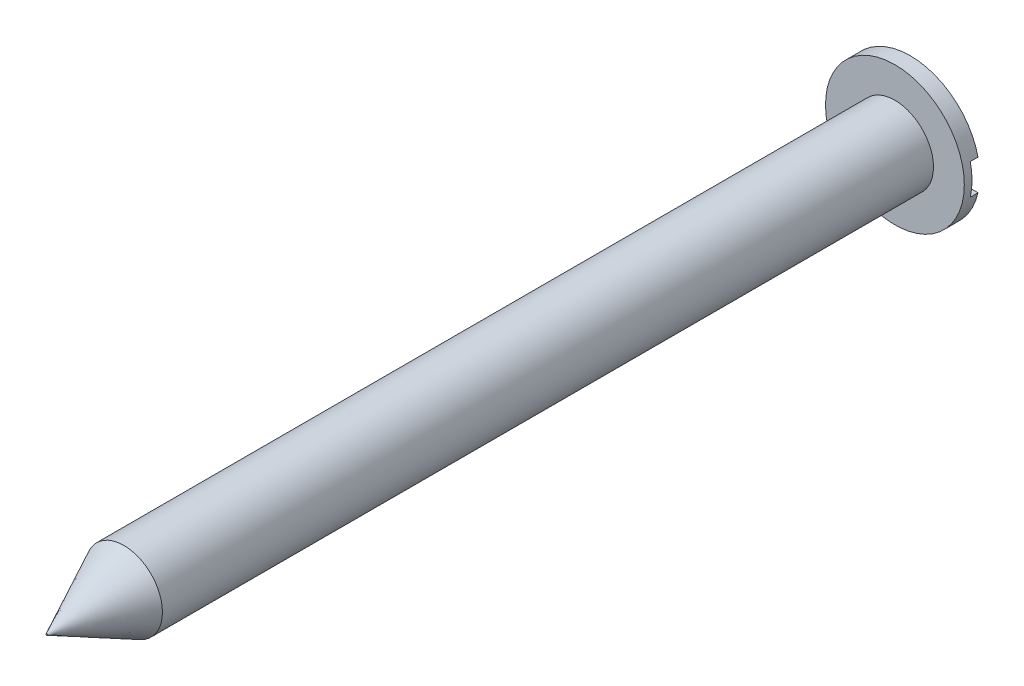
ISO-10303-21;
HEADER;
FILE_DESCRIPTION(('STEP AP214'),'2;1');
FILE_NAME('part.step','',(''),(''),'','','');
FILE_SCHEMA(('AUTOMOTIVE_DESIGN { 1 0 10303 214 1 1 1 1 }'));
ENDSEC;
DATA;
#1=APPLICATION_CONTEXT('core data for automotive mechanical design processes');
#2=APPLICATION_PROTOCOL_DEFINITION('international standard','automotive_design',2000,#1);
#3=PRODUCT_CONTEXT('',#1,'mechanical');
#4=PRODUCT('Part','Part','',(#3));
#5=PRODUCT_RELATED_PRODUCT_CATEGORY('part','',(#4));
#6=PRODUCT_DEFINITION_FORMATION('','',#4);
#7=PRODUCT_DEFINITION_CONTEXT('part definition',#1,'design');
#8=PRODUCT_DEFINITION('design','',#6,#7);
#9=PRODUCT_DEFINITION_SHAPE('','',#8);
#10=(LENGTH_UNIT() NAMED_UNIT(*) SI_UNIT(.MILLI.,.METRE.));
#11=(NAMED_UNIT(*) PLANE_ANGLE_UNIT() SI_UNIT($,.RADIAN.));
#12=(NAMED_UNIT(*) SI_UNIT($,.STERADIAN.) SOLID_ANGLE_UNIT());
#13=UNCERTAINTY_MEASURE_WITH_UNIT(LENGTH_MEASURE(1.E-05),#10,'distance_accuracy_value','');
#14=(GEOMETRIC_REPRESENTATION_CONTEXT(3) GLOBAL_UNCERTAINTY_ASSIGNED_CONTEXT((#13)) GLOBAL_UNIT_ASSIGNED_CONTEXT((#10,
#11,#12)) REPRESENTATION_CONTEXT('',''));
#15=CARTESIAN_POINT('',(0.,0.,0.));
#16=DIRECTION('',(0.,0.,1.));
#17=DIRECTION('',(1.,0.,0.));
#18=AXIS2_PLACEMENT_3D('',#15,#16,#17);
#19=CARTESIAN_POINT('',(0.,0.,0.));
#20=DIRECTION('',(0.,0.,1.));
#21=DIRECTION('',(1.,0.,0.));
#22=AXIS2_PLACEMENT_3D('',#19,#20,#21);
#23=PLANE('',#22);
#24=CARTESIAN_POINT('',(0.,0.,0.));
#25=DIRECTION('',(0.,0.,1.));
#26=DIRECTION('',(1.,0.,0.));
#27=AXIS2_PLACEMENT_3D('',#24,#25,#26);
#28=CIRCLE('',#27,4.5);
#29=CARTESIAN_POINT('',(-4.38748219369606,-1.,0.));
#30=VERTEX_POINT('',#29);
#31=CARTESIAN_POINT('',(4.38748219369606,-1.,0.));
#32=VERTEX_POINT('',#31);
#33=EDGE_CURVE('E123',#30,#32,#28,.T.);
#34=ORIENTED_EDGE('',*,*,#33,.F.);
#35=DIRECTION('',(1.,0.,0.));
#36=VECTOR('',#35,1.);
#37=CARTESIAN_POINT('',(0.,-1.,0.));
#38=LINE('',#37,#36);
#39=EDGE_CURVE('E104',#30,#32,#38,.T.);
#40=ORIENTED_EDGE('',*,*,#39,.T.);
#41=EDGE_LOOP('',(#34,#40));
#42=FACE_BOUND('',#41,.T.);
#43=ADVANCED_FACE('F47',(#42),#23,.F.);
#44=CARTESIAN_POINT('',(0.,0.,1.));
#45=DIRECTION('',(0.,0.,-1.));
#46=DIRECTION('',(-1.,0.,0.));
#47=AXIS2_PLACEMENT_3D('',#44,#45,#46);
#48=CYLINDRICAL_SURFACE('',#47,4.5);
#49=CARTESIAN_POINT('',(0.,0.,1.));
#50=DIRECTION('',(0.,0.,1.));
#51=DIRECTION('',(1.,0.,0.));
#52=AXIS2_PLACEMENT_3D('',#49,#50,#51);
#53=CIRCLE('',#52,4.5);
#54=CARTESIAN_POINT('',(4.5,0.,1.));
#55=VERTEX_POINT('',#54);
#56=EDGE_CURVE('E108',#55,#55,#53,.T.);
#57=ORIENTED_EDGE('',*,*,#56,.F.);
#58=EDGE_LOOP('',(#57));
#59=FACE_BOUND('',#58,.T.);
#60=ORIENTED_EDGE('',*,*,#33,.T.);
#61=DIRECTION('',(0.,0.,-1.));
#62=VECTOR('',#61,1.);
#63=CARTESIAN_POINT('',(4.38748219369606,-1.,0.999999999999999));
#64=LINE('',#63,#62);
#65=CARTESIAN_POINT('',(4.38748219369606,-1.,0.5));
#66=VERTEX_POINT('',#65);
#67=EDGE_CURVE('E121',#32,#66,#64,.F.);
#68=ORIENTED_EDGE('',*,*,#67,.T.);
#69=CARTESIAN_POINT('',(0.,0.,0.5));
#70=DIRECTION('',(0.,0.,1.));
#71=DIRECTION('',(0.,-1.,0.));
#72=AXIS2_PLACEMENT_3D('',#69,#70,#71);
#73=CIRCLE('',#72,4.5);
#74=CARTESIAN_POINT('',(4.38748219369606,1.,0.5));
#75=VERTEX_POINT('',#74);
#76=EDGE_CURVE('E84',#66,#75,#73,.T.);
#77=ORIENTED_EDGE('',*,*,#76,.T.);
#78=DIRECTION('',(0.,0.,-1.));
#79=VECTOR('',#78,1.);
#80=CARTESIAN_POINT('',(4.38748219369606,1.,1.));
#81=LINE('',#80,#79);
#82=CARTESIAN_POINT('',(4.38748219369606,1.,0.));
#83=VERTEX_POINT('',#82);
#84=EDGE_CURVE('E68',#75,#83,#81,.T.);
#85=ORIENTED_EDGE('',*,*,#84,.T.);
#86=CARTESIAN_POINT('',(-4.38748219369606,1.,0.));
#87=VERTEX_POINT('',#86);
#88=EDGE_CURVE('E117',#83,#87,#28,.T.);
#89=ORIENTED_EDGE('',*,*,#88,.T.);
#90=DIRECTION('',(0.,0.,-1.));
#91=VECTOR('',#90,1.);
#92=CARTESIAN_POINT('',(-4.38748219369606,1.,1.));
#93=LINE('',#92,#91);
#94=CARTESIAN_POINT('',(-4.38748219369606,1.,0.5));
#95=VERTEX_POINT('',#94);
#96=EDGE_CURVE('E94',#87,#95,#93,.F.);
#97=ORIENTED_EDGE('',*,*,#96,.T.);
#98=CARTESIAN_POINT('',(-4.38748219369606,-1.,0.5));
#99=VERTEX_POINT('',#98);
#100=EDGE_CURVE('E80',#95,#99,#73,.T.);
#101=ORIENTED_EDGE('',*,*,#100,.T.);
#102=DIRECTION('',(0.,0.,-1.));
#103=VECTOR('',#102,1.);
#104=CARTESIAN_POINT('',(-4.38748219369606,-1.,0.999999999999999));
#105=LINE('',#104,#103);
#106=EDGE_CURVE('E99',#99,#30,#105,.T.);
#107=ORIENTED_EDGE('',*,*,#106,.T.);
#108=EDGE_LOOP('',(#60,#68,#77,#85,#89,#97,#101,#107));
#109=FACE_BOUND('',#108,.T.);
#110=ADVANCED_FACE('F114',(#59,#109),#48,.T.);
#111=CARTESIAN_POINT('',(0.,0.,1.));
#112=DIRECTION('',(0.,0.,1.));
#113=DIRECTION('',(1.,0.,0.));
#114=AXIS2_PLACEMENT_3D('',#111,#112,#113);
#115=PLANE('',#114);
#116=CARTESIAN_POINT('',(0.,0.,1.));
#117=DIRECTION('',(0.,0.,1.));
#118=DIRECTION('',(1.,0.,0.));
#119=AXIS2_PLACEMENT_3D('',#116,#117,#118);
#120=CIRCLE('',#119,2.5);
#121=CARTESIAN_POINT('',(2.5,0.,1.));
#122=VERTEX_POINT('',#121);
#123=EDGE_CURVE('E111',#122,#122,#120,.T.);
#124=ORIENTED_EDGE('',*,*,#123,.F.);
#125=EDGE_LOOP('',(#124));
#126=FACE_BOUND('',#125,.T.);
#127=ORIENTED_EDGE('',*,*,#56,.T.);
#128=EDGE_LOOP('',(#127));
#129=FACE_BOUND('',#128,.T.);
#130=ADVANCED_FACE('F198',(#126,#129),#115,.T.);
#131=ORIENTED_EDGE('',*,*,#88,.F.);
#132=DIRECTION('',(-1.,0.,0.));
#133=VECTOR('',#132,1.);
#134=CARTESIAN_POINT('',(0.,1.,0.));
#135=LINE('',#134,#133);
#136=EDGE_CURVE('E128',#83,#87,#135,.T.);
#137=ORIENTED_EDGE('',*,*,#136,.T.);
#138=EDGE_LOOP('',(#131,#137));
#139=FACE_BOUND('',#138,.T.);
#140=ADVANCED_FACE('F194',(#139),#23,.F.);
#141=CARTESIAN_POINT('',(-4.5,1.,0.5));
#142=DIRECTION('',(0.,0.,1.));
#143=DIRECTION('',(0.,-1.,0.));
#144=AXIS2_PLACEMENT_3D('',#141,#142,#143);
#145=PLANE('',#144);
#146=DIRECTION('',(1.,0.,0.));
#147=VECTOR('',#146,1.);
#148=CARTESIAN_POINT('',(-4.5,-1.,0.5));
#149=LINE('',#148,#147);
#150=EDGE_CURVE('E101',#99,#66,#149,.T.);
#151=ORIENTED_EDGE('',*,*,#150,.F.);
#152=ORIENTED_EDGE('',*,*,#100,.F.);
#153=DIRECTION('',(1.,0.,0.));
#154=VECTOR('',#153,1.);
#155=CARTESIAN_POINT('',(-4.5,1.,0.5));
#156=LINE('',#155,#154);
#157=EDGE_CURVE('E112',#95,#75,#156,.T.);
#158=ORIENTED_EDGE('',*,*,#157,.T.);
#159=ORIENTED_EDGE('',*,*,#76,.F.);
#160=EDGE_LOOP('',(#151,#152,#158,#159));
#161=FACE_BOUND('',#160,.T.);
#162=ADVANCED_FACE('F110',(#161),#145,.F.);
#163=CARTESIAN_POINT('',(-4.5,-1.,0.));
#164=DIRECTION('',(0.,-1.,0.));
#165=DIRECTION('',(0.,0.,-1.));
#166=AXIS2_PLACEMENT_3D('',#163,#164,#165);
#167=PLANE('',#166);
#168=ORIENTED_EDGE('',*,*,#150,.T.);
#169=ORIENTED_EDGE('',*,*,#67,.F.);
#170=ORIENTED_EDGE('',*,*,#39,.F.);
#171=ORIENTED_EDGE('',*,*,#106,.F.);
#172=EDGE_LOOP('',(#168,#169,#170,#171));
#173=FACE_BOUND('',#172,.T.);
#174=ADVANCED_FACE('F100',(#173),#167,.F.);
#175=CARTESIAN_POINT('',(-4.5,1.,0.));
#176=DIRECTION('',(0.,1.,0.));
#177=DIRECTION('',(0.,0.,1.));
#178=AXIS2_PLACEMENT_3D('',#175,#176,#177);
#179=PLANE('',#178);
#180=ORIENTED_EDGE('',*,*,#157,.F.);
#181=ORIENTED_EDGE('',*,*,#96,.F.);
#182=ORIENTED_EDGE('',*,*,#136,.F.);
#183=ORIENTED_EDGE('',*,*,#84,.F.);
#184=EDGE_LOOP('',(#180,#181,#182,#183));
#185=FACE_BOUND('',#184,.T.);
#186=ADVANCED_FACE('F175',(#185),#179,.F.);
#187=CARTESIAN_POINT('',(0.,0.,56.));
#188=DIRECTION('',(0.,0.,-1.));
#189=DIRECTION('',(-1.,0.,0.));
#190=AXIS2_PLACEMENT_3D('',#187,#188,#189);
#191=CYLINDRICAL_SURFACE('',#190,2.5);
#192=CARTESIAN_POINT('',(0.,0.,51.));
#193=DIRECTION('',(0.,0.,1.));
#194=DIRECTION('',(1.,0.,0.));
#195=AXIS2_PLACEMENT_3D('',#192,#193,#194);
#196=CIRCLE('',#195,2.5);
#197=CARTESIAN_POINT('',(-1.95597702644147,1.55696945122028,51.));
#198=VERTEX_POINT('',#197);
#199=EDGE_CURVE('E60',#198,#198,#196,.T.);
#200=ORIENTED_EDGE('',*,*,#199,.F.);
#201=EDGE_LOOP('',(#200));
#202=FACE_BOUND('',#201,.T.);
#203=ORIENTED_EDGE('',*,*,#123,.T.);
#204=EDGE_LOOP('',(#203));
#205=FACE_BOUND('',#204,.T.);
#206=ADVANCED_FACE('F172',(#202,#205),#191,.T.);
#207=CARTESIAN_POINT('',(-2.12409554384429,1.69329666155818,50.5592284869875));
#208=CARTESIAN_POINT('',(-1.95597702644147,1.55696945122028,51.));
#209=CARTESIAN_POINT('',(-0.0488833005587263,0.0105082313680865,56.));
#210=CARTESIAN_POINT('',(-5.51068886696064,-2.55489442613039,50.5592284869875));
#211=CARTESIAN_POINT('',(-5.06991592888203,-2.35498460166265,51.));
#212=CARTESIAN_POINT('',(-0.0698997632948992,-0.087258369749366,56.));
#213=CARTESIAN_POINT('',(-1.26249777927207,-5.94148774924674,50.5592284869875));
#214=CARTESIAN_POINT('',(-1.15796187599909,-5.46892350410322,51.));
#215=CARTESIAN_POINT('',(0.0278668378225533,-0.108274832485539,56.));
#216=CARTESIAN_POINT('',(2.12409554384428,-1.69329666155818,50.5592284869875));
#217=CARTESIAN_POINT('',(1.95597702644147,-1.55696945122028,51.));
#218=CARTESIAN_POINT('',(0.0488833005587263,-0.0105082313680865,56.));
#219=CARTESIAN_POINT('',(5.51068886696065,2.55489442613039,50.5592284869875));
#220=CARTESIAN_POINT('',(5.06991592888204,2.35498460166265,51.));
#221=CARTESIAN_POINT('',(0.0698997632948992,0.087258369749366,56.));
#222=CARTESIAN_POINT('',(1.26249777927208,5.94148774924675,50.5592284869875));
#223=CARTESIAN_POINT('',(1.1579618759991,5.46892350410322,51.));
#224=CARTESIAN_POINT('',(-0.0278668378225533,0.108274832485539,56.));
#225=CARTESIAN_POINT('',(-2.12409554384429,1.69329666155818,50.5592284869875));
#226=CARTESIAN_POINT('',(-1.95597702644147,1.55696945122028,51.));
#227=CARTESIAN_POINT('',(-0.0488833005587263,0.0105082313680865,56.));
#228=(BOUNDED_SURFACE() B_SPLINE_SURFACE(3,1,((#207,#208,#209),(#210,#211,#212),(#213,#214,
#215),(#216,#217,#218),(#219,#220,#221),(#222,#223,#224),(#225,#226,#227)),.UNSPECIFIED.,.T.,
.F.,.F.) B_SPLINE_SURFACE_WITH_KNOTS((4,3,4),(2,1,2),(0.,0.5,1.),(-0.0881543026025103,0.,1.),
.UNSPECIFIED.) GEOMETRIC_REPRESENTATION_ITEM() RATIONAL_B_SPLINE_SURFACE(((1.,1.,1.),
(0.333333333333334,0.333333333333334,0.333333333333333),(0.333333333333334,0.333333333333334,
0.333333333333333),(1.,1.,1.),(0.333333333333333,0.333333333333333,0.333333333333333),
(0.333333333333333,0.333333333333333,0.333333333333333),(1.,1.,1.))) REPRESENTATION_ITEM('') SURFACE());
#229=CARTESIAN_POINT('',(0.,0.,56.));
#230=DIRECTION('',(0.,0.,1.));
#231=DIRECTION('',(1.,0.,0.));
#232=AXIS2_PLACEMENT_3D('',#229,#230,#231);
#233=CIRCLE('',#232,0.05);
#234=CARTESIAN_POINT('',(-0.0488833005587263,0.0105082313680865,56.));
#235=VERTEX_POINT('',#234);
#236=EDGE_CURVE('E12',#235,#235,#233,.T.);
#237=CARTESIAN_POINT('',(-1.95597702644147,1.55696945122028,51.));
#238=CARTESIAN_POINT('',(-1.93611146679686,1.54086048018016,51.0520833333333));
#239=CARTESIAN_POINT('',(-1.91624590715225,1.52475150914003,51.1041666666667));
#240=CARTESIAN_POINT('',(-1.87651478786302,1.49253356705977,51.2083333333333));
#241=CARTESIAN_POINT('',(-1.85664922821841,1.47642459601965,51.2604166666667));
#242=CARTESIAN_POINT('',(-1.81691810892919,1.44420665393939,51.3645833333333));
#243=CARTESIAN_POINT('',(-1.79705254928458,1.42809768289927,51.4166666666667));
#244=CARTESIAN_POINT('',(-1.75732142999535,1.39587974081901,51.5208333333333));
#245=CARTESIAN_POINT('',(-1.73745587035074,1.37977076977889,51.5729166666667));
#246=CARTESIAN_POINT('',(-1.69772475106152,1.34755282769863,51.6770833333333));
#247=CARTESIAN_POINT('',(-1.6778591914169,1.3314438566585,51.7291666666667));
#248=CARTESIAN_POINT('',(-1.63812807212768,1.29922591457825,51.8333333333333));
#249=CARTESIAN_POINT('',(-1.61826251248307,1.28311694353812,51.8854166666667));
#250=CARTESIAN_POINT('',(-1.57853139319384,1.25089900145787,51.9895833333333));
#251=CARTESIAN_POINT('',(-1.55866583354923,1.23479003041774,52.0416666666667));
#252=CARTESIAN_POINT('',(-1.51893471426001,1.20257208833749,52.1458333333333));
#253=CARTESIAN_POINT('',(-1.4990691546154,1.18646311729736,52.1979166666667));
#254=CARTESIAN_POINT('',(-1.45933803532617,1.15424517521711,52.3020833333333));
#255=CARTESIAN_POINT('',(-1.43947247568156,1.13813620417698,52.3541666666667));
#256=CARTESIAN_POINT('',(-1.39974135639234,1.10591826209672,52.4583333333333));
#257=CARTESIAN_POINT('',(-1.37987579674773,1.0898092910566,52.5104166666667));
#258=CARTESIAN_POINT('',(-1.3401446774585,1.05759134897634,52.6145833333333));
#259=CARTESIAN_POINT('',(-1.32027911781389,1.04148237793622,52.6666666666667));
#260=CARTESIAN_POINT('',(-1.28054799852467,1.00926443585596,52.7708333333333));
#261=CARTESIAN_POINT('',(-1.26068243888005,0.993155464815836,52.8229166666667));
#262=CARTESIAN_POINT('',(-1.22095131959083,0.960937522735582,52.9270833333333));
#263=CARTESIAN_POINT('',(-1.20108575994622,0.944828551695455,52.9791666666667));
#264=CARTESIAN_POINT('',(-1.16135464065699,0.912610609615201,53.0833333333333));
#265=CARTESIAN_POINT('',(-1.14148908101238,0.896501638575074,53.1354166666667));
#266=CARTESIAN_POINT('',(-1.10175796172316,0.86428369649482,53.2395833333333));
#267=CARTESIAN_POINT('',(-1.08189240207855,0.848174725454692,53.2916666666667));
#268=CARTESIAN_POINT('',(-1.04216128278932,0.815956783374438,53.3958333333333));
#269=CARTESIAN_POINT('',(-1.02229572314471,0.799847812334312,53.4479166666667));
#270=CARTESIAN_POINT('',(-0.982564603855487,0.767629870254058,53.5520833333333));
#271=CARTESIAN_POINT('',(-0.962699044210875,0.75152089921393,53.6041666666667));
#272=CARTESIAN_POINT('',(-0.922967924921651,0.719302957133676,53.7083333333333));
#273=CARTESIAN_POINT('',(-0.90310236527704,0.70319398609355,53.7604166666667));
#274=CARTESIAN_POINT('',(-0.863371245987815,0.670976044013295,53.8645833333333));
#275=CARTESIAN_POINT('',(-0.843505686343202,0.654867072973167,53.9166666666667));
#276=CARTESIAN_POINT('',(-0.803774567053979,0.622649130892914,54.0208333333333));
#277=CARTESIAN_POINT('',(-0.783909007409368,0.606540159852787,54.0729166666667));
#278=CARTESIAN_POINT('',(-0.744177888120145,0.574322217772534,54.1770833333333));
#279=CARTESIAN_POINT('',(-0.724312328475532,0.558213246732406,54.2291666666667));
#280=CARTESIAN_POINT('',(-0.684581209186308,0.525995304652152,54.3333333333333));
#281=CARTESIAN_POINT('',(-0.664715649541696,0.509886333612025,54.3854166666667));
#282=CARTESIAN_POINT('',(-0.624984530252472,0.477668391531771,54.4895833333333));
#283=CARTESIAN_POINT('',(-0.60511897060786,0.461559420491643,54.5416666666667));
#284=CARTESIAN_POINT('',(-0.565387851318636,0.429341478411389,54.6458333333333));
#285=CARTESIAN_POINT('',(-0.545522291674024,0.413232507371262,54.6979166666667));
#286=CARTESIAN_POINT('',(-0.505791172384801,0.381014565291009,54.8020833333333));
#287=CARTESIAN_POINT('',(-0.485925612740189,0.364905594250882,54.8541666666667));
#288=CARTESIAN_POINT('',(-0.446194493450965,0.332687652170627,54.9583333333333));
#289=CARTESIAN_POINT('',(-0.426328933806353,0.3165786811305,55.0104166666667));
#290=CARTESIAN_POINT('',(-0.386597814517129,0.284360739050246,55.1145833333333));
#291=CARTESIAN_POINT('',(-0.366732254872517,0.268251768010119,55.1666666666667));
#292=CARTESIAN_POINT('',(-0.327001135583293,0.236033825929865,55.2708333333333));
#293=CARTESIAN_POINT('',(-0.307135575938681,0.219924854889738,55.3229166666667));
#294=CARTESIAN_POINT('',(-0.267404456649458,0.187706912809484,55.4270833333333));
#295=CARTESIAN_POINT('',(-0.247538897004846,0.171597941769357,55.4791666666667));
#296=CARTESIAN_POINT('',(-0.207807777715622,0.139379999689103,55.5833333333333));
#297=CARTESIAN_POINT('',(-0.18794221807101,0.123271028648976,55.6354166666667));
#298=CARTESIAN_POINT('',(-0.148211098781786,0.0910530865687215,55.7395833333333));
#299=CARTESIAN_POINT('',(-0.128345539137174,0.0749441155285944,55.7916666666667));
#300=CARTESIAN_POINT('',(-0.0886144198479497,0.0427261734483402,55.8958333333333));
#301=CARTESIAN_POINT('',(-0.0687488602033377,0.0266172024082131,55.9479166666667));
#302=CARTESIAN_POINT('',(-0.0488833005587263,0.0105082313680865,56.));
#303=B_SPLINE_CURVE_WITH_KNOTS('',3,(#237,#238,#239,#240,#241,#242,#243,#244,#245,#246,#247,
#248,#249,#250,#251,#252,#253,#254,#255,#256,#257,#258,#259,#260,#261,#262,#263,#264,#265,#266,
#267,#268,#269,#270,#271,#272,#273,#274,#275,#276,#277,#278,#279,#280,#281,#282,#283,#284,#285,
#286,#287,#288,#289,#290,#291,#292,#293,#294,#295,#296,#297,#298,#299,#300,#301,#302),
.UNSPECIFIED.,.F.,.F.,(4,2,2,2,2,2,2,2,2,2,2,2,2,2,2,2,2,2,2,2,2,2,2,2,2,2,2,2,2,2,2,2,4),(0.,
0.174072735290995,0.348145470581983,0.522218205872978,0.696290941163972,0.870363676454961,
1.04443641174595,1.21850914703694,1.39258188232794,1.56665461761892,1.74072735290992,
1.91480008820091,2.0888728234919,2.26294555878289,2.43701829407389,2.61109102936488,
2.78516376465587,2.95923649994686,3.13330923523785,3.30738197052884,3.48145470581984,
3.65552744111083,3.82960017640182,4.0036729116928,4.1777456469838,4.35181838227479,
4.52589111756578,4.69996385285677,4.87403658814776,5.04810932343876,5.22218205872975,
5.39625479402074,5.57032752931173),.UNSPECIFIED.);
#304=EDGE_CURVE('BSEAM49',#198,#235,#303,.T.);
#305=ORIENTED_EDGE('',*,*,#199,.T.);
#306=ORIENTED_EDGE('',*,*,#236,.F.);
#307=ORIENTED_EDGE('',*,*,#304,.T.);
#308=ORIENTED_EDGE('',*,*,#304,.F.);
#309=EDGE_LOOP('',(#305,#307,#306,#308));
#310=FACE_BOUND('',#309,.T.);
#311=ADVANCED_FACE('F49',(#310),#228,.T.);
#312=CARTESIAN_POINT('',(0.,0.,56.));
#313=DIRECTION('',(0.,0.,1.));
#314=DIRECTION('',(1.,0.,0.));
#315=AXIS2_PLACEMENT_3D('',#312,#313,#314);
#316=PLANE('',#315);
#317=ORIENTED_EDGE('',*,*,#236,.T.);
#318=EDGE_LOOP('',(#317));
#319=FACE_BOUND('',#318,.T.);
#320=ADVANCED_FACE('F155',(#319),#316,.T.);
#321=CLOSED_SHELL('',(#43,#110,#130,#140,#162,#174,#186,#206,#311,#320));
#322=MANIFOLD_SOLID_BREP('B2',#321);
#323=ADVANCED_BREP_SHAPE_REPRESENTATION('',(#18,#322),#14);
#324=SHAPE_DEFINITION_REPRESENTATION(#9,#323);
ENDSEC;
END-ISO-10303-21;
